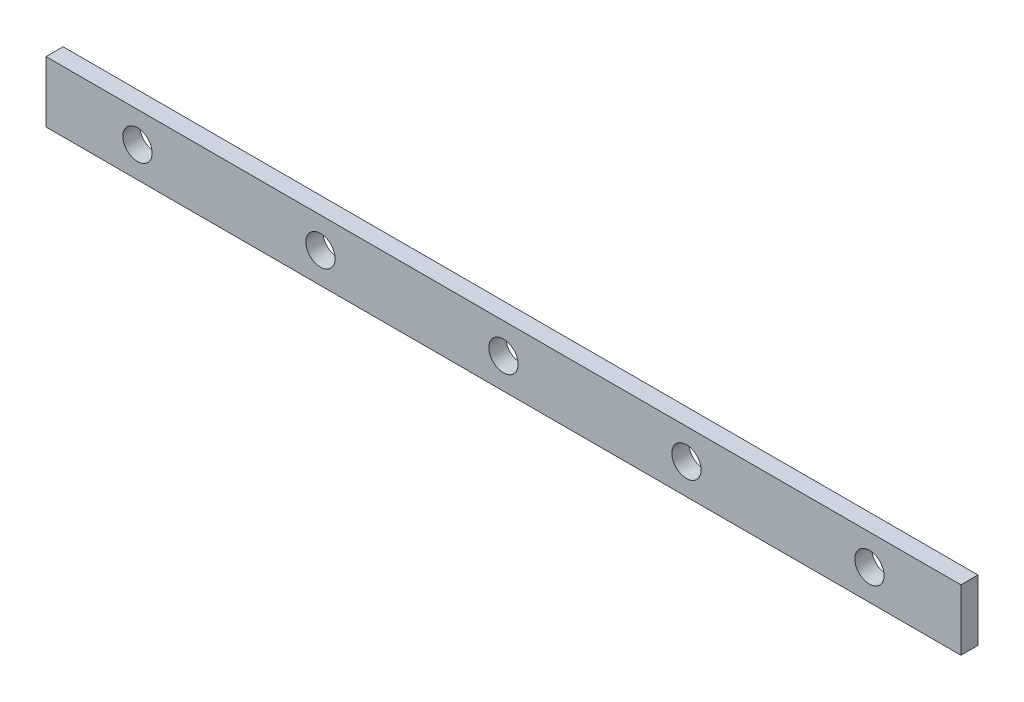
ISO-10303-21;
HEADER;
FILE_DESCRIPTION(('STEP AP214'),'2;1');
FILE_NAME('part.step','',(''),(''),'','','');
FILE_SCHEMA(('AUTOMOTIVE_DESIGN { 1 0 10303 214 1 1 1 1 }'));
ENDSEC;
DATA;
#1=APPLICATION_CONTEXT('core data for automotive mechanical design processes');
#2=APPLICATION_PROTOCOL_DEFINITION('international standard','automotive_design',2000,#1);
#3=PRODUCT_CONTEXT('',#1,'mechanical');
#4=PRODUCT('Part','Part','',(#3));
#5=PRODUCT_RELATED_PRODUCT_CATEGORY('part','',(#4));
#6=PRODUCT_DEFINITION_FORMATION('','',#4);
#7=PRODUCT_DEFINITION_CONTEXT('part definition',#1,'design');
#8=PRODUCT_DEFINITION('design','',#6,#7);
#9=PRODUCT_DEFINITION_SHAPE('','',#8);
#10=(LENGTH_UNIT() NAMED_UNIT(*) SI_UNIT(.MILLI.,.METRE.));
#11=(NAMED_UNIT(*) PLANE_ANGLE_UNIT() SI_UNIT($,.RADIAN.));
#12=(NAMED_UNIT(*) SI_UNIT($,.STERADIAN.) SOLID_ANGLE_UNIT());
#13=UNCERTAINTY_MEASURE_WITH_UNIT(LENGTH_MEASURE(1.E-05),#10,'distance_accuracy_value','');
#14=(GEOMETRIC_REPRESENTATION_CONTEXT(3) GLOBAL_UNCERTAINTY_ASSIGNED_CONTEXT((#13)) GLOBAL_UNIT_ASSIGNED_CONTEXT((#10,
#11,#12)) REPRESENTATION_CONTEXT('',''));
#15=CARTESIAN_POINT('',(0.,0.,0.));
#16=DIRECTION('',(0.,0.,1.));
#17=DIRECTION('',(1.,0.,0.));
#18=AXIS2_PLACEMENT_3D('',#15,#16,#17);
#19=CARTESIAN_POINT('',(37.5,-2.5,1.4));
#20=DIRECTION('',(-1.,0.,0.));
#21=DIRECTION('',(0.,0.,1.));
#22=AXIS2_PLACEMENT_3D('',#19,#20,#21);
#23=PLANE('',#22);
#24=DIRECTION('',(0.,1.,0.));
#25=VECTOR('',#24,1.);
#26=CARTESIAN_POINT('',(37.5,-2.5,0.));
#27=LINE('',#26,#25);
#28=CARTESIAN_POINT('',(37.5,-2.5,0.));
#29=VERTEX_POINT('',#28);
#30=CARTESIAN_POINT('',(37.5,2.5,0.));
#31=VERTEX_POINT('',#30);
#32=EDGE_CURVE('E101',#29,#31,#27,.T.);
#33=ORIENTED_EDGE('',*,*,#32,.T.);
#34=DIRECTION('',(0.,0.,-1.));
#35=VECTOR('',#34,1.);
#36=CARTESIAN_POINT('',(37.5,2.5,1.4));
#37=LINE('',#36,#35);
#38=CARTESIAN_POINT('',(37.5,2.5,1.4));
#39=VERTEX_POINT('',#38);
#40=EDGE_CURVE('E11',#39,#31,#37,.T.);
#41=ORIENTED_EDGE('',*,*,#40,.F.);
#42=DIRECTION('',(0.,1.,0.));
#43=VECTOR('',#42,1.);
#44=CARTESIAN_POINT('',(37.5,-2.5,1.4));
#45=LINE('',#44,#43);
#46=CARTESIAN_POINT('',(37.5,-2.5,1.4));
#47=VERTEX_POINT('',#46);
#48=EDGE_CURVE('E88',#47,#39,#45,.T.);
#49=ORIENTED_EDGE('',*,*,#48,.F.);
#50=DIRECTION('',(0.,0.,-1.));
#51=VECTOR('',#50,1.);
#52=CARTESIAN_POINT('',(37.5,-2.5,1.4));
#53=LINE('',#52,#51);
#54=EDGE_CURVE('E97',#47,#29,#53,.T.);
#55=ORIENTED_EDGE('',*,*,#54,.T.);
#56=EDGE_LOOP('',(#33,#41,#49,#55));
#57=FACE_BOUND('',#56,.T.);
#58=ADVANCED_FACE('F35',(#57),#23,.F.);
#59=CARTESIAN_POINT('',(-37.5,2.5,1.4));
#60=DIRECTION('',(0.,-1.,0.));
#61=DIRECTION('',(0.,0.,-1.));
#62=AXIS2_PLACEMENT_3D('',#59,#60,#61);
#63=PLANE('',#62);
#64=DIRECTION('',(-1.,0.,0.));
#65=VECTOR('',#64,1.);
#66=CARTESIAN_POINT('',(-37.5,2.5,0.));
#67=LINE('',#66,#65);
#68=CARTESIAN_POINT('',(-37.5,2.5,0.));
#69=VERTEX_POINT('',#68);
#70=EDGE_CURVE('E92',#31,#69,#67,.T.);
#71=ORIENTED_EDGE('',*,*,#70,.T.);
#72=DIRECTION('',(0.,0.,-1.));
#73=VECTOR('',#72,1.);
#74=CARTESIAN_POINT('',(-37.5,2.5,1.4));
#75=LINE('',#74,#73);
#76=CARTESIAN_POINT('',(-37.5,2.5,1.4));
#77=VERTEX_POINT('',#76);
#78=EDGE_CURVE('E44',#77,#69,#75,.T.);
#79=ORIENTED_EDGE('',*,*,#78,.F.);
#80=DIRECTION('',(-1.,0.,0.));
#81=VECTOR('',#80,1.);
#82=CARTESIAN_POINT('',(-37.5,2.5,1.4));
#83=LINE('',#82,#81);
#84=EDGE_CURVE('E83',#39,#77,#83,.T.);
#85=ORIENTED_EDGE('',*,*,#84,.F.);
#86=ORIENTED_EDGE('',*,*,#40,.T.);
#87=EDGE_LOOP('',(#71,#79,#85,#86));
#88=FACE_BOUND('',#87,.T.);
#89=ADVANCED_FACE('F91',(#88),#63,.F.);
#90=CARTESIAN_POINT('',(-37.5,-2.5,1.4));
#91=DIRECTION('',(1.,0.,0.));
#92=DIRECTION('',(0.,0.,-1.));
#93=AXIS2_PLACEMENT_3D('',#90,#91,#92);
#94=PLANE('',#93);
#95=DIRECTION('',(0.,-1.,0.));
#96=VECTOR('',#95,1.);
#97=CARTESIAN_POINT('',(-37.5,-2.5,0.));
#98=LINE('',#97,#96);
#99=CARTESIAN_POINT('',(-37.5,-2.5,0.));
#100=VERTEX_POINT('',#99);
#101=EDGE_CURVE('E70',#69,#100,#98,.T.);
#102=ORIENTED_EDGE('',*,*,#101,.T.);
#103=DIRECTION('',(0.,0.,-1.));
#104=VECTOR('',#103,1.);
#105=CARTESIAN_POINT('',(-37.5,-2.5,1.4));
#106=LINE('',#105,#104);
#107=CARTESIAN_POINT('',(-37.5,-2.5,1.4));
#108=VERTEX_POINT('',#107);
#109=EDGE_CURVE('E93',#108,#100,#106,.T.);
#110=ORIENTED_EDGE('',*,*,#109,.F.);
#111=DIRECTION('',(0.,-1.,0.));
#112=VECTOR('',#111,1.);
#113=CARTESIAN_POINT('',(-37.5,-2.5,1.4));
#114=LINE('',#113,#112);
#115=EDGE_CURVE('E86',#77,#108,#114,.T.);
#116=ORIENTED_EDGE('',*,*,#115,.F.);
#117=ORIENTED_EDGE('',*,*,#78,.T.);
#118=EDGE_LOOP('',(#102,#110,#116,#117));
#119=FACE_BOUND('',#118,.T.);
#120=ADVANCED_FACE('F95',(#119),#94,.F.);
#121=CARTESIAN_POINT('',(-37.5,-2.5,1.4));
#122=DIRECTION('',(0.,1.,0.));
#123=DIRECTION('',(0.,0.,1.));
#124=AXIS2_PLACEMENT_3D('',#121,#122,#123);
#125=PLANE('',#124);
#126=DIRECTION('',(1.,0.,0.));
#127=VECTOR('',#126,1.);
#128=CARTESIAN_POINT('',(-37.5,-2.5,0.));
#129=LINE('',#128,#127);
#130=EDGE_CURVE('E76',#100,#29,#129,.T.);
#131=ORIENTED_EDGE('',*,*,#130,.T.);
#132=ORIENTED_EDGE('',*,*,#54,.F.);
#133=DIRECTION('',(1.,0.,0.));
#134=VECTOR('',#133,1.);
#135=CARTESIAN_POINT('',(-37.5,-2.5,1.4));
#136=LINE('',#135,#134);
#137=EDGE_CURVE('E53',#108,#47,#136,.T.);
#138=ORIENTED_EDGE('',*,*,#137,.F.);
#139=ORIENTED_EDGE('',*,*,#109,.T.);
#140=EDGE_LOOP('',(#131,#132,#138,#139));
#141=FACE_BOUND('',#140,.T.);
#142=ADVANCED_FACE('F142',(#141),#125,.F.);
#143=CARTESIAN_POINT('',(0.,0.,1.4));
#144=DIRECTION('',(0.,0.,-1.));
#145=DIRECTION('',(-1.,0.,0.));
#146=AXIS2_PLACEMENT_3D('',#143,#144,#145);
#147=PLANE('',#146);
#148=CARTESIAN_POINT('',(-30.,0.,1.4));
#149=DIRECTION('',(0.,0.,1.));
#150=DIRECTION('',(1.,0.,0.));
#151=AXIS2_PLACEMENT_3D('',#148,#149,#150);
#152=CIRCLE('',#151,1.20000000000008);
#153=CARTESIAN_POINT('',(-28.7999999999999,0.,1.4));
#154=VERTEX_POINT('',#153);
#155=EDGE_CURVE('E113',#154,#154,#152,.T.);
#156=ORIENTED_EDGE('',*,*,#155,.F.);
#157=EDGE_LOOP('',(#156));
#158=FACE_BOUND('',#157,.T.);
#159=CARTESIAN_POINT('',(-15.,1.09287578986539E-13,1.4));
#160=DIRECTION('',(0.,0.,1.));
#161=DIRECTION('',(1.,0.,0.));
#162=AXIS2_PLACEMENT_3D('',#159,#160,#161);
#163=CIRCLE('',#162,1.20000000000009);
#164=CARTESIAN_POINT('',(-13.7999999999999,1.09287578986539E-13,1.4));
#165=VERTEX_POINT('',#164);
#166=EDGE_CURVE('E227',#165,#165,#163,.T.);
#167=ORIENTED_EDGE('',*,*,#166,.F.);
#168=EDGE_LOOP('',(#167));
#169=FACE_BOUND('',#168,.T.);
#170=CARTESIAN_POINT('',(0.,2.22044604925031E-13,1.4));
#171=DIRECTION('',(0.,0.,1.));
#172=DIRECTION('',(1.,0.,0.));
#173=AXIS2_PLACEMENT_3D('',#170,#171,#172);
#174=CIRCLE('',#173,1.20000000000009);
#175=CARTESIAN_POINT('',(1.2000000000001,2.22044604925031E-13,1.4));
#176=VERTEX_POINT('',#175);
#177=EDGE_CURVE('E229',#176,#176,#174,.T.);
#178=ORIENTED_EDGE('',*,*,#177,.F.);
#179=EDGE_LOOP('',(#178));
#180=FACE_BOUND('',#179,.T.);
#181=CARTESIAN_POINT('',(15.,3.27862736959617E-13,1.4));
#182=DIRECTION('',(0.,0.,1.));
#183=DIRECTION('',(1.,0.,0.));
#184=AXIS2_PLACEMENT_3D('',#181,#182,#183);
#185=CIRCLE('',#184,1.20000000000009);
#186=CARTESIAN_POINT('',(16.2000000000001,3.27862736959617E-13,1.4));
#187=VERTEX_POINT('',#186);
#188=EDGE_CURVE('E234',#187,#187,#185,.T.);
#189=ORIENTED_EDGE('',*,*,#188,.F.);
#190=EDGE_LOOP('',(#189));
#191=FACE_BOUND('',#190,.T.);
#192=CARTESIAN_POINT('',(30.,4.38885039422132E-13,1.4));
#193=DIRECTION('',(0.,0.,1.));
#194=DIRECTION('',(1.,0.,0.));
#195=AXIS2_PLACEMENT_3D('',#192,#193,#194);
#196=CIRCLE('',#195,1.20000000000009);
#197=CARTESIAN_POINT('',(31.2000000000001,4.38885039422132E-13,1.4));
#198=VERTEX_POINT('',#197);
#199=EDGE_CURVE('E239',#198,#198,#196,.T.);
#200=ORIENTED_EDGE('',*,*,#199,.F.);
#201=EDGE_LOOP('',(#200));
#202=FACE_BOUND('',#201,.T.);
#203=ORIENTED_EDGE('',*,*,#48,.T.);
#204=ORIENTED_EDGE('',*,*,#84,.T.);
#205=ORIENTED_EDGE('',*,*,#115,.T.);
#206=ORIENTED_EDGE('',*,*,#137,.T.);
#207=EDGE_LOOP('',(#203,#204,#205,#206));
#208=FACE_BOUND('',#207,.T.);
#209=ADVANCED_FACE('F84',(#158,#169,#180,#191,#202,#208),#147,.F.);
#210=CARTESIAN_POINT('',(0.,0.,0.));
#211=DIRECTION('',(0.,0.,-1.));
#212=DIRECTION('',(-1.,0.,0.));
#213=AXIS2_PLACEMENT_3D('',#210,#211,#212);
#214=PLANE('',#213);
#215=CARTESIAN_POINT('',(-30.,0.,0.));
#216=DIRECTION('',(0.,0.,-1.));
#217=DIRECTION('',(-1.,0.,0.));
#218=AXIS2_PLACEMENT_3D('',#215,#216,#217);
#219=CIRCLE('',#218,1.20000000000008);
#220=CARTESIAN_POINT('',(-31.2000000000001,0.,0.));
#221=VERTEX_POINT('',#220);
#222=EDGE_CURVE('E38',#221,#221,#219,.T.);
#223=ORIENTED_EDGE('',*,*,#222,.F.);
#224=EDGE_LOOP('',(#223));
#225=FACE_BOUND('',#224,.T.);
#226=CARTESIAN_POINT('',(-15.,1.09287578986539E-13,0.));
#227=DIRECTION('',(0.,0.,-1.));
#228=DIRECTION('',(-1.,0.,0.));
#229=AXIS2_PLACEMENT_3D('',#226,#227,#228);
#230=CIRCLE('',#229,1.20000000000009);
#231=CARTESIAN_POINT('',(-16.2000000000001,1.09287578986539E-13,0.));
#232=VERTEX_POINT('',#231);
#233=EDGE_CURVE('E118',#232,#232,#230,.T.);
#234=ORIENTED_EDGE('',*,*,#233,.F.);
#235=EDGE_LOOP('',(#234));
#236=FACE_BOUND('',#235,.T.);
#237=CARTESIAN_POINT('',(0.,2.22044604925031E-13,0.));
#238=DIRECTION('',(0.,0.,-1.));
#239=DIRECTION('',(-1.,0.,0.));
#240=AXIS2_PLACEMENT_3D('',#237,#238,#239);
#241=CIRCLE('',#240,1.20000000000009);
#242=CARTESIAN_POINT('',(-1.20000000000007,2.22044604925031E-13,0.));
#243=VERTEX_POINT('',#242);
#244=EDGE_CURVE('E116',#243,#243,#241,.T.);
#245=ORIENTED_EDGE('',*,*,#244,.F.);
#246=EDGE_LOOP('',(#245));
#247=FACE_BOUND('',#246,.T.);
#248=CARTESIAN_POINT('',(15.,3.27862736959617E-13,0.));
#249=DIRECTION('',(0.,0.,-1.));
#250=DIRECTION('',(-1.,0.,0.));
#251=AXIS2_PLACEMENT_3D('',#248,#249,#250);
#252=CIRCLE('',#251,1.20000000000009);
#253=CARTESIAN_POINT('',(13.7999999999999,3.27862736959617E-13,0.));
#254=VERTEX_POINT('',#253);
#255=EDGE_CURVE('E112',#254,#254,#252,.T.);
#256=ORIENTED_EDGE('',*,*,#255,.F.);
#257=EDGE_LOOP('',(#256));
#258=FACE_BOUND('',#257,.T.);
#259=CARTESIAN_POINT('',(30.,4.38885039422132E-13,0.));
#260=DIRECTION('',(0.,0.,-1.));
#261=DIRECTION('',(-1.,0.,0.));
#262=AXIS2_PLACEMENT_3D('',#259,#260,#261);
#263=CIRCLE('',#262,1.20000000000009);
#264=CARTESIAN_POINT('',(28.7999999999999,4.38885039422132E-13,0.));
#265=VERTEX_POINT('',#264);
#266=EDGE_CURVE('E109',#265,#265,#263,.T.);
#267=ORIENTED_EDGE('',*,*,#266,.F.);
#268=EDGE_LOOP('',(#267));
#269=FACE_BOUND('',#268,.T.);
#270=ORIENTED_EDGE('',*,*,#32,.F.);
#271=ORIENTED_EDGE('',*,*,#130,.F.);
#272=ORIENTED_EDGE('',*,*,#101,.F.);
#273=ORIENTED_EDGE('',*,*,#70,.F.);
#274=EDGE_LOOP('',(#270,#271,#272,#273));
#275=FACE_BOUND('',#274,.T.);
#276=ADVANCED_FACE('F128',(#225,#236,#247,#258,#269,#275),#214,.T.);
#277=CARTESIAN_POINT('',(30.,4.38885039422132E-13,-50.));
#278=DIRECTION('',(0.,0.,1.));
#279=DIRECTION('',(1.,0.,0.));
#280=AXIS2_PLACEMENT_3D('',#277,#278,#279);
#281=CYLINDRICAL_SURFACE('',#280,1.20000000000009);
#282=ORIENTED_EDGE('',*,*,#266,.T.);
#283=EDGE_LOOP('',(#282));
#284=FACE_BOUND('',#283,.T.);
#285=ORIENTED_EDGE('',*,*,#199,.T.);
#286=EDGE_LOOP('',(#285));
#287=FACE_BOUND('',#286,.T.);
#288=ADVANCED_FACE('F131',(#284,#287),#281,.F.);
#289=CARTESIAN_POINT('',(15.,3.27862736959617E-13,-50.));
#290=DIRECTION('',(0.,0.,1.));
#291=DIRECTION('',(1.,0.,0.));
#292=AXIS2_PLACEMENT_3D('',#289,#290,#291);
#293=CYLINDRICAL_SURFACE('',#292,1.20000000000009);
#294=ORIENTED_EDGE('',*,*,#255,.T.);
#295=EDGE_LOOP('',(#294));
#296=FACE_BOUND('',#295,.T.);
#297=ORIENTED_EDGE('',*,*,#188,.T.);
#298=EDGE_LOOP('',(#297));
#299=FACE_BOUND('',#298,.T.);
#300=ADVANCED_FACE('F183',(#296,#299),#293,.F.);
#301=CARTESIAN_POINT('',(0.,2.22044604925031E-13,-50.));
#302=DIRECTION('',(0.,0.,1.));
#303=DIRECTION('',(1.,0.,0.));
#304=AXIS2_PLACEMENT_3D('',#301,#302,#303);
#305=CYLINDRICAL_SURFACE('',#304,1.20000000000009);
#306=ORIENTED_EDGE('',*,*,#244,.T.);
#307=EDGE_LOOP('',(#306));
#308=FACE_BOUND('',#307,.T.);
#309=ORIENTED_EDGE('',*,*,#177,.T.);
#310=EDGE_LOOP('',(#309));
#311=FACE_BOUND('',#310,.T.);
#312=ADVANCED_FACE('F193',(#308,#311),#305,.F.);
#313=CARTESIAN_POINT('',(-15.,1.09287578986539E-13,-50.));
#314=DIRECTION('',(0.,0.,1.));
#315=DIRECTION('',(1.,0.,0.));
#316=AXIS2_PLACEMENT_3D('',#313,#314,#315);
#317=CYLINDRICAL_SURFACE('',#316,1.20000000000009);
#318=ORIENTED_EDGE('',*,*,#233,.T.);
#319=EDGE_LOOP('',(#318));
#320=FACE_BOUND('',#319,.T.);
#321=ORIENTED_EDGE('',*,*,#166,.T.);
#322=EDGE_LOOP('',(#321));
#323=FACE_BOUND('',#322,.T.);
#324=ADVANCED_FACE('F203',(#320,#323),#317,.F.);
#325=CARTESIAN_POINT('',(-30.,0.,-50.));
#326=DIRECTION('',(0.,0.,1.));
#327=DIRECTION('',(1.,0.,0.));
#328=AXIS2_PLACEMENT_3D('',#325,#326,#327);
#329=CYLINDRICAL_SURFACE('',#328,1.20000000000008);
#330=ORIENTED_EDGE('',*,*,#222,.T.);
#331=EDGE_LOOP('',(#330));
#332=FACE_BOUND('',#331,.T.);
#333=ORIENTED_EDGE('',*,*,#155,.T.);
#334=EDGE_LOOP('',(#333));
#335=FACE_BOUND('',#334,.T.);
#336=ADVANCED_FACE('F125',(#332,#335),#329,.F.);
#337=CLOSED_SHELL('',(#58,#89,#120,#142,#209,#276,#288,#300,#312,#324,#336));
#338=MANIFOLD_SOLID_BREP('B2',#337);
#339=ADVANCED_BREP_SHAPE_REPRESENTATION('',(#18,#338),#14);
#340=SHAPE_DEFINITION_REPRESENTATION(#9,#339);
ENDSEC;
END-ISO-10303-21;
